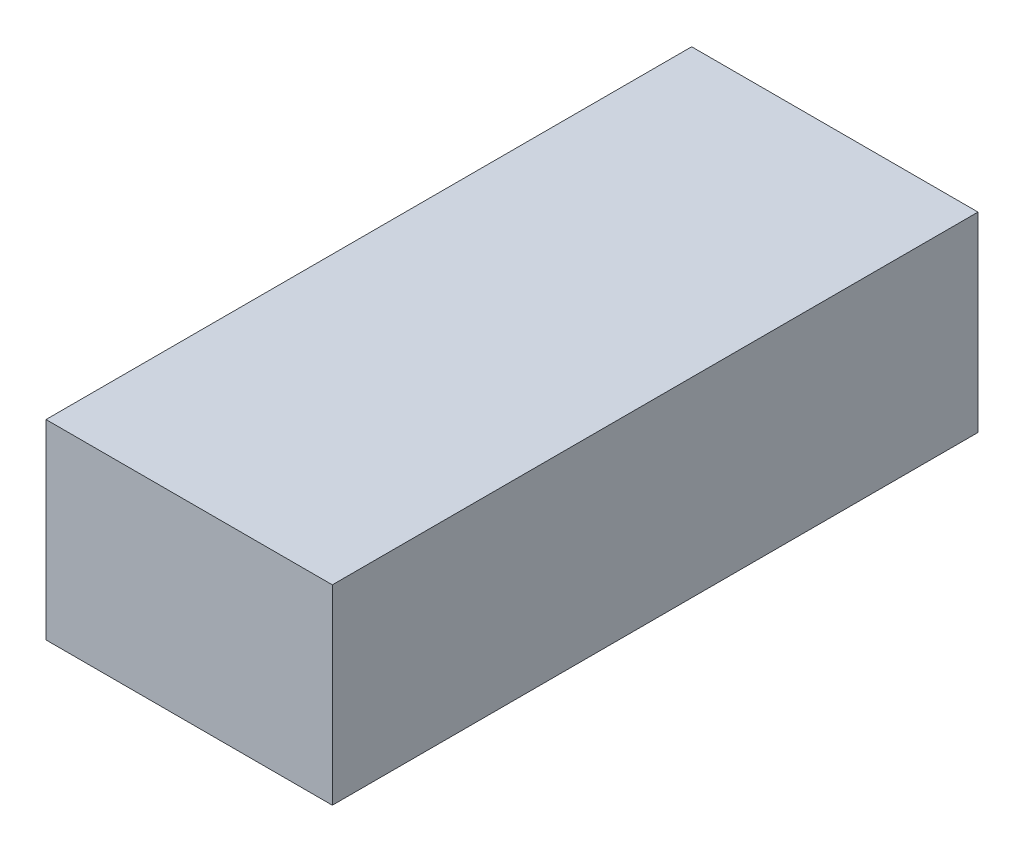
ISO-10303-21;
HEADER;
FILE_DESCRIPTION(('STEP AP214'),'2;1');
FILE_NAME('part.step','',(''),(''),'','','');
FILE_SCHEMA(('AUTOMOTIVE_DESIGN { 1 0 10303 214 1 1 1 1 }'));
ENDSEC;
DATA;
#1=APPLICATION_CONTEXT('core data for automotive mechanical design processes');
#2=APPLICATION_PROTOCOL_DEFINITION('international standard','automotive_design',2000,#1);
#3=PRODUCT_CONTEXT('',#1,'mechanical');
#4=PRODUCT('Part','Part','',(#3));
#5=PRODUCT_RELATED_PRODUCT_CATEGORY('part','',(#4));
#6=PRODUCT_DEFINITION_FORMATION('','',#4);
#7=PRODUCT_DEFINITION_CONTEXT('part definition',#1,'design');
#8=PRODUCT_DEFINITION('design','',#6,#7);
#9=PRODUCT_DEFINITION_SHAPE('','',#8);
#10=(LENGTH_UNIT() NAMED_UNIT(*) SI_UNIT(.MILLI.,.METRE.));
#11=(NAMED_UNIT(*) PLANE_ANGLE_UNIT() SI_UNIT($,.RADIAN.));
#12=(NAMED_UNIT(*) SI_UNIT($,.STERADIAN.) SOLID_ANGLE_UNIT());
#13=UNCERTAINTY_MEASURE_WITH_UNIT(LENGTH_MEASURE(1.E-05),#10,'distance_accuracy_value','');
#14=(GEOMETRIC_REPRESENTATION_CONTEXT(3) GLOBAL_UNCERTAINTY_ASSIGNED_CONTEXT((#13)) GLOBAL_UNIT_ASSIGNED_CONTEXT((#10,
#11,#12)) REPRESENTATION_CONTEXT('',''));
#15=CARTESIAN_POINT('',(0.,0.,0.));
#16=DIRECTION('',(0.,0.,1.));
#17=DIRECTION('',(1.,0.,0.));
#18=AXIS2_PLACEMENT_3D('',#15,#16,#17);
#19=CARTESIAN_POINT('',(0.,34.,0.));
#20=DIRECTION('',(1.,0.,0.));
#21=DIRECTION('',(0.,0.,-1.));
#22=AXIS2_PLACEMENT_3D('',#19,#20,#21);
#23=PLANE('',#22);
#24=DIRECTION('',(0.,0.,1.));
#25=VECTOR('',#24,1.);
#26=CARTESIAN_POINT('',(0.,0.,0.));
#27=LINE('',#26,#25);
#28=CARTESIAN_POINT('',(0.,0.,-115.));
#29=VERTEX_POINT('',#28);
#30=CARTESIAN_POINT('',(0.,0.,0.));
#31=VERTEX_POINT('',#30);
#32=EDGE_CURVE('E107',#29,#31,#27,.T.);
#33=ORIENTED_EDGE('',*,*,#32,.T.);
#34=DIRECTION('',(0.,-1.,0.));
#35=VECTOR('',#34,1.);
#36=CARTESIAN_POINT('',(0.,34.,0.));
#37=LINE('',#36,#35);
#38=CARTESIAN_POINT('',(0.,34.,0.));
#39=VERTEX_POINT('',#38);
#40=EDGE_CURVE('E11',#39,#31,#37,.T.);
#41=ORIENTED_EDGE('',*,*,#40,.F.);
#42=DIRECTION('',(0.,0.,1.));
#43=VECTOR('',#42,1.);
#44=CARTESIAN_POINT('',(0.,34.,0.));
#45=LINE('',#44,#43);
#46=CARTESIAN_POINT('',(0.,34.,-115.));
#47=VERTEX_POINT('',#46);
#48=EDGE_CURVE('E91',#47,#39,#45,.T.);
#49=ORIENTED_EDGE('',*,*,#48,.F.);
#50=DIRECTION('',(0.,-1.,0.));
#51=VECTOR('',#50,1.);
#52=CARTESIAN_POINT('',(0.,34.,-115.));
#53=LINE('',#52,#51);
#54=EDGE_CURVE('E103',#47,#29,#53,.T.);
#55=ORIENTED_EDGE('',*,*,#54,.T.);
#56=EDGE_LOOP('',(#33,#41,#49,#55));
#57=FACE_BOUND('',#56,.T.);
#58=ADVANCED_FACE('F39',(#57),#23,.F.);
#59=CARTESIAN_POINT('',(0.,34.,0.));
#60=DIRECTION('',(0.,0.,-1.));
#61=DIRECTION('',(-1.,0.,0.));
#62=AXIS2_PLACEMENT_3D('',#59,#60,#61);
#63=PLANE('',#62);
#64=DIRECTION('',(1.,0.,0.));
#65=VECTOR('',#64,1.);
#66=CARTESIAN_POINT('',(0.,0.,0.));
#67=LINE('',#66,#65);
#68=CARTESIAN_POINT('',(51.,0.,0.));
#69=VERTEX_POINT('',#68);
#70=EDGE_CURVE('E96',#31,#69,#67,.T.);
#71=ORIENTED_EDGE('',*,*,#70,.T.);
#72=DIRECTION('',(0.,-1.,0.));
#73=VECTOR('',#72,1.);
#74=CARTESIAN_POINT('',(51.,34.,0.));
#75=LINE('',#74,#73);
#76=CARTESIAN_POINT('',(51.,34.,0.));
#77=VERTEX_POINT('',#76);
#78=EDGE_CURVE('E48',#77,#69,#75,.T.);
#79=ORIENTED_EDGE('',*,*,#78,.F.);
#80=DIRECTION('',(1.,0.,0.));
#81=VECTOR('',#80,1.);
#82=CARTESIAN_POINT('',(0.,34.,0.));
#83=LINE('',#82,#81);
#84=EDGE_CURVE('E86',#39,#77,#83,.T.);
#85=ORIENTED_EDGE('',*,*,#84,.F.);
#86=ORIENTED_EDGE('',*,*,#40,.T.);
#87=EDGE_LOOP('',(#71,#79,#85,#86));
#88=FACE_BOUND('',#87,.T.);
#89=ADVANCED_FACE('F95',(#88),#63,.F.);
#90=CARTESIAN_POINT('',(51.,34.,0.));
#91=DIRECTION('',(-1.,0.,0.));
#92=DIRECTION('',(0.,0.,1.));
#93=AXIS2_PLACEMENT_3D('',#90,#91,#92);
#94=PLANE('',#93);
#95=DIRECTION('',(0.,0.,-1.));
#96=VECTOR('',#95,1.);
#97=CARTESIAN_POINT('',(51.,0.,0.));
#98=LINE('',#97,#96);
#99=CARTESIAN_POINT('',(51.,0.,-115.));
#100=VERTEX_POINT('',#99);
#101=EDGE_CURVE('E73',#69,#100,#98,.T.);
#102=ORIENTED_EDGE('',*,*,#101,.T.);
#103=DIRECTION('',(0.,-1.,0.));
#104=VECTOR('',#103,1.);
#105=CARTESIAN_POINT('',(51.,34.,-115.));
#106=LINE('',#105,#104);
#107=CARTESIAN_POINT('',(51.,34.,-115.));
#108=VERTEX_POINT('',#107);
#109=EDGE_CURVE('E98',#108,#100,#106,.T.);
#110=ORIENTED_EDGE('',*,*,#109,.F.);
#111=DIRECTION('',(0.,0.,-1.));
#112=VECTOR('',#111,1.);
#113=CARTESIAN_POINT('',(51.,34.,0.));
#114=LINE('',#113,#112);
#115=EDGE_CURVE('E89',#77,#108,#114,.T.);
#116=ORIENTED_EDGE('',*,*,#115,.F.);
#117=ORIENTED_EDGE('',*,*,#78,.T.);
#118=EDGE_LOOP('',(#102,#110,#116,#117));
#119=FACE_BOUND('',#118,.T.);
#120=ADVANCED_FACE('F99',(#119),#94,.F.);
#121=CARTESIAN_POINT('',(0.,34.,-115.));
#122=DIRECTION('',(0.,0.,1.));
#123=DIRECTION('',(1.,0.,0.));
#124=AXIS2_PLACEMENT_3D('',#121,#122,#123);
#125=PLANE('',#124);
#126=DIRECTION('',(-1.,0.,0.));
#127=VECTOR('',#126,1.);
#128=CARTESIAN_POINT('',(0.,0.,-115.));
#129=LINE('',#128,#127);
#130=EDGE_CURVE('E79',#100,#29,#129,.T.);
#131=ORIENTED_EDGE('',*,*,#130,.T.);
#132=ORIENTED_EDGE('',*,*,#54,.F.);
#133=DIRECTION('',(-1.,0.,0.));
#134=VECTOR('',#133,1.);
#135=CARTESIAN_POINT('',(0.,34.,-115.));
#136=LINE('',#135,#134);
#137=EDGE_CURVE('E56',#108,#47,#136,.T.);
#138=ORIENTED_EDGE('',*,*,#137,.F.);
#139=ORIENTED_EDGE('',*,*,#109,.T.);
#140=EDGE_LOOP('',(#131,#132,#138,#139));
#141=FACE_BOUND('',#140,.T.);
#142=ADVANCED_FACE('F120',(#141),#125,.F.);
#143=CARTESIAN_POINT('',(0.,34.,0.));
#144=DIRECTION('',(0.,-1.,0.));
#145=DIRECTION('',(0.,0.,-1.));
#146=AXIS2_PLACEMENT_3D('',#143,#144,#145);
#147=PLANE('',#146);
#148=ORIENTED_EDGE('',*,*,#48,.T.);
#149=ORIENTED_EDGE('',*,*,#84,.T.);
#150=ORIENTED_EDGE('',*,*,#115,.T.);
#151=ORIENTED_EDGE('',*,*,#137,.T.);
#152=EDGE_LOOP('',(#148,#149,#150,#151));
#153=FACE_BOUND('',#152,.T.);
#154=ADVANCED_FACE('F87',(#153),#147,.F.);
#155=CARTESIAN_POINT('',(0.,0.,0.));
#156=DIRECTION('',(0.,-1.,0.));
#157=DIRECTION('',(0.,0.,-1.));
#158=AXIS2_PLACEMENT_3D('',#155,#156,#157);
#159=PLANE('',#158);
#160=ORIENTED_EDGE('',*,*,#32,.F.);
#161=ORIENTED_EDGE('',*,*,#130,.F.);
#162=ORIENTED_EDGE('',*,*,#101,.F.);
#163=ORIENTED_EDGE('',*,*,#70,.F.);
#164=EDGE_LOOP('',(#160,#161,#162,#163));
#165=FACE_BOUND('',#164,.T.);
#166=ADVANCED_FACE('F123',(#165),#159,.T.);
#167=CLOSED_SHELL('',(#58,#89,#120,#142,#154,#166));
#168=MANIFOLD_SOLID_BREP('B2',#167);
#169=ADVANCED_BREP_SHAPE_REPRESENTATION('',(#18,#168),#14);
#170=SHAPE_DEFINITION_REPRESENTATION(#9,#169);
ENDSEC;
END-ISO-10303-21;
